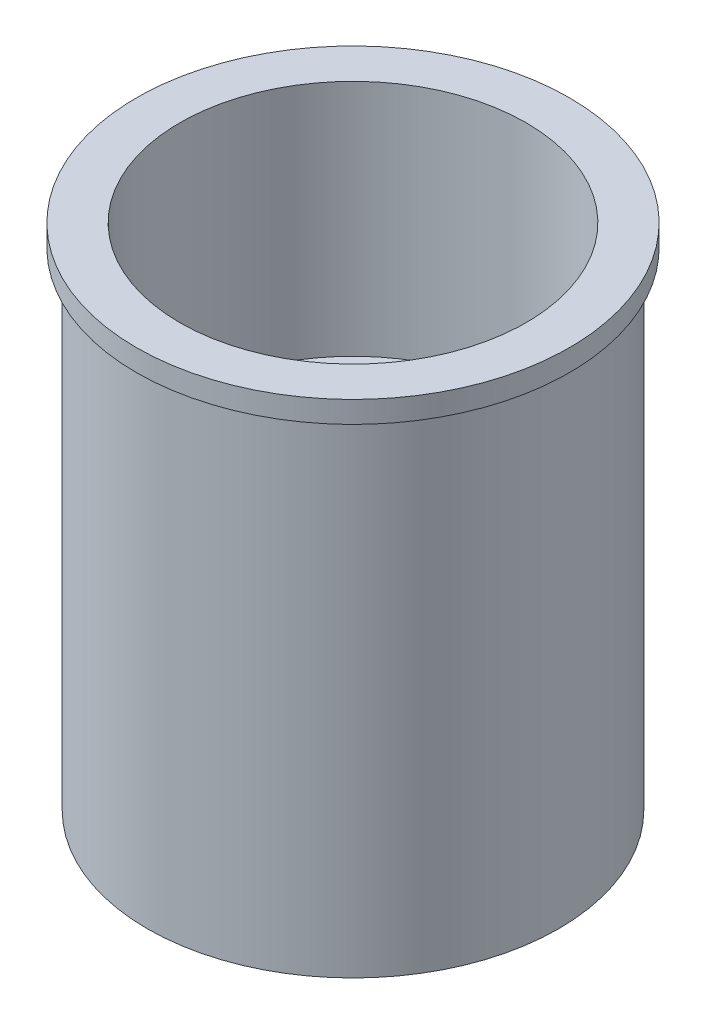
ISO-10303-21;
HEADER;
FILE_DESCRIPTION(('STEP AP214'),'2;1');
FILE_NAME('part.step','',(''),(''),'','','');
FILE_SCHEMA(('AUTOMOTIVE_DESIGN { 1 0 10303 214 1 1 1 1 }'));
ENDSEC;
DATA;
#1=APPLICATION_CONTEXT('core data for automotive mechanical design processes');
#2=APPLICATION_PROTOCOL_DEFINITION('international standard','automotive_design',2000,#1);
#3=PRODUCT_CONTEXT('',#1,'mechanical');
#4=PRODUCT('Part','Part','',(#3));
#5=PRODUCT_RELATED_PRODUCT_CATEGORY('part','',(#4));
#6=PRODUCT_DEFINITION_FORMATION('','',#4);
#7=PRODUCT_DEFINITION_CONTEXT('part definition',#1,'design');
#8=PRODUCT_DEFINITION('design','',#6,#7);
#9=PRODUCT_DEFINITION_SHAPE('','',#8);
#10=(LENGTH_UNIT() NAMED_UNIT(*) SI_UNIT(.MILLI.,.METRE.));
#11=(NAMED_UNIT(*) PLANE_ANGLE_UNIT() SI_UNIT($,.RADIAN.));
#12=(NAMED_UNIT(*) SI_UNIT($,.STERADIAN.) SOLID_ANGLE_UNIT());
#13=UNCERTAINTY_MEASURE_WITH_UNIT(LENGTH_MEASURE(1.E-05),#10,'distance_accuracy_value','');
#14=(GEOMETRIC_REPRESENTATION_CONTEXT(3) GLOBAL_UNCERTAINTY_ASSIGNED_CONTEXT((#13)) GLOBAL_UNIT_ASSIGNED_CONTEXT((#10,
#11,#12)) REPRESENTATION_CONTEXT('',''));
#15=CARTESIAN_POINT('',(0.,0.,0.));
#16=DIRECTION('',(0.,0.,1.));
#17=DIRECTION('',(1.,0.,0.));
#18=AXIS2_PLACEMENT_3D('',#15,#16,#17);
#19=CARTESIAN_POINT('',(-19.,-15.1621621621622,0.));
#20=DIRECTION('',(0.,-1.,0.));
#21=DIRECTION('',(0.,0.,-1.));
#22=AXIS2_PLACEMENT_3D('',#19,#20,#21);
#23=PLANE('',#22);
#24=CARTESIAN_POINT('',(0.,-15.1621621621622,0.));
#25=DIRECTION('',(0.,1.,0.));
#26=DIRECTION('',(0.,0.,1.));
#27=AXIS2_PLACEMENT_3D('',#24,#25,#26);
#28=CIRCLE('',#27,16.);
#29=CARTESIAN_POINT('',(0.,-15.1621621621622,16.));
#30=VERTEX_POINT('',#29);
#31=EDGE_CURVE('E10',#30,#30,#28,.T.);
#32=ORIENTED_EDGE('',*,*,#31,.T.);
#33=EDGE_LOOP('',(#32));
#34=FACE_BOUND('',#33,.T.);
#35=CARTESIAN_POINT('',(0.,-15.1621621621622,0.));
#36=DIRECTION('',(0.,1.,0.));
#37=DIRECTION('',(0.,0.,1.));
#38=AXIS2_PLACEMENT_3D('',#35,#36,#37);
#39=CIRCLE('',#38,19.);
#40=CARTESIAN_POINT('',(0.,-15.1621621621622,19.));
#41=VERTEX_POINT('',#40);
#42=EDGE_CURVE('E65',#41,#41,#39,.T.);
#43=ORIENTED_EDGE('',*,*,#42,.F.);
#44=EDGE_LOOP('',(#43));
#45=FACE_BOUND('',#44,.T.);
#46=ADVANCED_FACE('F31',(#34,#45),#23,.T.);
#47=CARTESIAN_POINT('',(0.,35.1891891891891,0.));
#48=DIRECTION('',(0.,1.,0.));
#49=DIRECTION('',(0.,0.,1.));
#50=AXIS2_PLACEMENT_3D('',#47,#48,#49);
#51=CYLINDRICAL_SURFACE('',#50,16.);
#52=CARTESIAN_POINT('',(0.,6.83783783783779,0.));
#53=DIRECTION('',(0.,1.,0.));
#54=DIRECTION('',(0.,0.,1.));
#55=AXIS2_PLACEMENT_3D('',#52,#53,#54);
#56=CIRCLE('',#55,16.);
#57=CARTESIAN_POINT('',(0.,6.83783783783779,16.));
#58=VERTEX_POINT('',#57);
#59=EDGE_CURVE('E37',#58,#58,#56,.T.);
#60=ORIENTED_EDGE('',*,*,#59,.T.);
#61=EDGE_LOOP('',(#60));
#62=FACE_BOUND('',#61,.T.);
#63=ORIENTED_EDGE('',*,*,#31,.F.);
#64=EDGE_LOOP('',(#63));
#65=FACE_BOUND('',#64,.T.);
#66=ADVANCED_FACE('F73',(#62,#65),#51,.F.);
#67=CARTESIAN_POINT('',(-16.,6.83783783783779,0.));
#68=DIRECTION('',(0.,-1.,0.));
#69=DIRECTION('',(0.,0.,-1.));
#70=AXIS2_PLACEMENT_3D('',#67,#68,#69);
#71=PLANE('',#70);
#72=CARTESIAN_POINT('',(0.,6.83783783783779,0.));
#73=DIRECTION('',(0.,1.,0.));
#74=DIRECTION('',(0.,0.,1.));
#75=AXIS2_PLACEMENT_3D('',#72,#73,#74);
#76=CIRCLE('',#75,14.);
#77=CARTESIAN_POINT('',(0.,6.83783783783779,14.));
#78=VERTEX_POINT('',#77);
#79=EDGE_CURVE('E41',#78,#78,#76,.T.);
#80=ORIENTED_EDGE('',*,*,#79,.T.);
#81=EDGE_LOOP('',(#80));
#82=FACE_BOUND('',#81,.T.);
#83=ORIENTED_EDGE('',*,*,#59,.F.);
#84=EDGE_LOOP('',(#83));
#85=FACE_BOUND('',#84,.T.);
#86=ADVANCED_FACE('F77',(#82,#85),#71,.T.);
#87=CARTESIAN_POINT('',(0.,35.1891891891891,0.));
#88=DIRECTION('',(0.,1.,0.));
#89=DIRECTION('',(0.,0.,1.));
#90=AXIS2_PLACEMENT_3D('',#87,#88,#89);
#91=CYLINDRICAL_SURFACE('',#90,14.);
#92=CARTESIAN_POINT('',(0.,9.83783783783779,0.));
#93=DIRECTION('',(0.,1.,0.));
#94=DIRECTION('',(0.,0.,1.));
#95=AXIS2_PLACEMENT_3D('',#92,#93,#94);
#96=CIRCLE('',#95,14.);
#97=CARTESIAN_POINT('',(0.,9.83783783783779,14.));
#98=VERTEX_POINT('',#97);
#99=EDGE_CURVE('E45',#98,#98,#96,.T.);
#100=ORIENTED_EDGE('',*,*,#99,.T.);
#101=EDGE_LOOP('',(#100));
#102=FACE_BOUND('',#101,.T.);
#103=ORIENTED_EDGE('',*,*,#79,.F.);
#104=EDGE_LOOP('',(#103));
#105=FACE_BOUND('',#104,.T.);
#106=ADVANCED_FACE('F81',(#102,#105),#91,.F.);
#107=CARTESIAN_POINT('',(-14.,9.83783783783779,0.));
#108=DIRECTION('',(0.,1.,0.));
#109=DIRECTION('',(0.,0.,1.));
#110=AXIS2_PLACEMENT_3D('',#107,#108,#109);
#111=PLANE('',#110);
#112=CARTESIAN_POINT('',(0.,9.83783783783779,0.));
#113=DIRECTION('',(0.,1.,0.));
#114=DIRECTION('',(0.,0.,1.));
#115=AXIS2_PLACEMENT_3D('',#112,#113,#114);
#116=CIRCLE('',#115,16.);
#117=CARTESIAN_POINT('',(0.,9.83783783783779,16.));
#118=VERTEX_POINT('',#117);
#119=EDGE_CURVE('E50',#118,#118,#116,.T.);
#120=ORIENTED_EDGE('',*,*,#119,.T.);
#121=EDGE_LOOP('',(#120));
#122=FACE_BOUND('',#121,.T.);
#123=ORIENTED_EDGE('',*,*,#99,.F.);
#124=EDGE_LOOP('',(#123));
#125=FACE_BOUND('',#124,.T.);
#126=ADVANCED_FACE('F88',(#122,#125),#111,.T.);
#127=CARTESIAN_POINT('',(0.,35.1891891891891,0.));
#128=DIRECTION('',(0.,1.,0.));
#129=DIRECTION('',(0.,0.,1.));
#130=AXIS2_PLACEMENT_3D('',#127,#128,#129);
#131=CYLINDRICAL_SURFACE('',#130,16.);
#132=CARTESIAN_POINT('',(0.,31.8378378378378,0.));
#133=DIRECTION('',(0.,1.,0.));
#134=DIRECTION('',(0.,0.,1.));
#135=AXIS2_PLACEMENT_3D('',#132,#133,#134);
#136=CIRCLE('',#135,16.);
#137=CARTESIAN_POINT('',(0.,31.8378378378378,16.));
#138=VERTEX_POINT('',#137);
#139=EDGE_CURVE('E53',#138,#138,#136,.T.);
#140=ORIENTED_EDGE('',*,*,#139,.T.);
#141=EDGE_LOOP('',(#140));
#142=FACE_BOUND('',#141,.T.);
#143=ORIENTED_EDGE('',*,*,#119,.F.);
#144=EDGE_LOOP('',(#143));
#145=FACE_BOUND('',#144,.T.);
#146=ADVANCED_FACE('F92',(#142,#145),#131,.F.);
#147=CARTESIAN_POINT('',(-16.,31.8378378378378,0.));
#148=DIRECTION('',(0.,1.,0.));
#149=DIRECTION('',(0.,0.,1.));
#150=AXIS2_PLACEMENT_3D('',#147,#148,#149);
#151=PLANE('',#150);
#152=CARTESIAN_POINT('',(0.,31.8378378378378,0.));
#153=DIRECTION('',(0.,1.,0.));
#154=DIRECTION('',(0.,0.,1.));
#155=AXIS2_PLACEMENT_3D('',#152,#153,#154);
#156=CIRCLE('',#155,20.);
#157=CARTESIAN_POINT('',(0.,31.8378378378378,20.));
#158=VERTEX_POINT('',#157);
#159=EDGE_CURVE('E56',#158,#158,#156,.T.);
#160=ORIENTED_EDGE('',*,*,#159,.T.);
#161=EDGE_LOOP('',(#160));
#162=FACE_BOUND('',#161,.T.);
#163=ORIENTED_EDGE('',*,*,#139,.F.);
#164=EDGE_LOOP('',(#163));
#165=FACE_BOUND('',#164,.T.);
#166=ADVANCED_FACE('F96',(#162,#165),#151,.T.);
#167=CARTESIAN_POINT('',(0.,35.1891891891891,0.));
#168=DIRECTION('',(0.,1.,0.));
#169=DIRECTION('',(0.,0.,1.));
#170=AXIS2_PLACEMENT_3D('',#167,#168,#169);
#171=CYLINDRICAL_SURFACE('',#170,20.);
#172=CARTESIAN_POINT('',(0.,29.8378378378378,0.));
#173=DIRECTION('',(0.,1.,0.));
#174=DIRECTION('',(0.,0.,1.));
#175=AXIS2_PLACEMENT_3D('',#172,#173,#174);
#176=CIRCLE('',#175,20.);
#177=CARTESIAN_POINT('',(0.,29.8378378378378,20.));
#178=VERTEX_POINT('',#177);
#179=EDGE_CURVE('E59',#178,#178,#176,.T.);
#180=ORIENTED_EDGE('',*,*,#179,.T.);
#181=EDGE_LOOP('',(#180));
#182=FACE_BOUND('',#181,.T.);
#183=ORIENTED_EDGE('',*,*,#159,.F.);
#184=EDGE_LOOP('',(#183));
#185=FACE_BOUND('',#184,.T.);
#186=ADVANCED_FACE('F100',(#182,#185),#171,.T.);
#187=CARTESIAN_POINT('',(-20.,29.8378378378378,0.));
#188=DIRECTION('',(0.,-1.,0.));
#189=DIRECTION('',(0.,0.,-1.));
#190=AXIS2_PLACEMENT_3D('',#187,#188,#189);
#191=PLANE('',#190);
#192=CARTESIAN_POINT('',(0.,29.8378378378378,0.));
#193=DIRECTION('',(0.,1.,0.));
#194=DIRECTION('',(0.,0.,1.));
#195=AXIS2_PLACEMENT_3D('',#192,#193,#194);
#196=CIRCLE('',#195,19.);
#197=CARTESIAN_POINT('',(0.,29.8378378378378,19.));
#198=VERTEX_POINT('',#197);
#199=EDGE_CURVE('E62',#198,#198,#196,.T.);
#200=ORIENTED_EDGE('',*,*,#199,.T.);
#201=EDGE_LOOP('',(#200));
#202=FACE_BOUND('',#201,.T.);
#203=ORIENTED_EDGE('',*,*,#179,.F.);
#204=EDGE_LOOP('',(#203));
#205=FACE_BOUND('',#204,.T.);
#206=ADVANCED_FACE('F104',(#202,#205),#191,.T.);
#207=CARTESIAN_POINT('',(0.,35.1891891891891,0.));
#208=DIRECTION('',(0.,1.,0.));
#209=DIRECTION('',(0.,0.,1.));
#210=AXIS2_PLACEMENT_3D('',#207,#208,#209);
#211=CYLINDRICAL_SURFACE('',#210,19.);
#212=ORIENTED_EDGE('',*,*,#42,.T.);
#213=EDGE_LOOP('',(#212));
#214=FACE_BOUND('',#213,.T.);
#215=ORIENTED_EDGE('',*,*,#199,.F.);
#216=EDGE_LOOP('',(#215));
#217=FACE_BOUND('',#216,.T.);
#218=ADVANCED_FACE('F69',(#214,#217),#211,.T.);
#219=CLOSED_SHELL('',(#46,#66,#86,#106,#126,#146,#166,#186,#206,#218));
#220=MANIFOLD_SOLID_BREP('B2',#219);
#221=ADVANCED_BREP_SHAPE_REPRESENTATION('',(#18,#220),#14);
#222=SHAPE_DEFINITION_REPRESENTATION(#9,#221);
ENDSEC;
END-ISO-10303-21;
